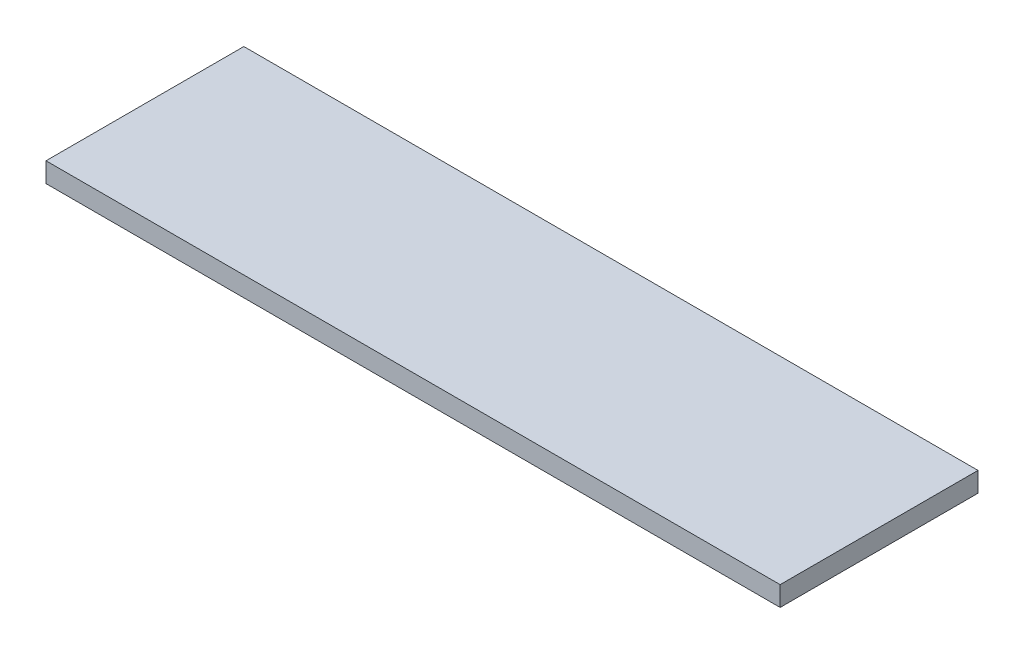
ISO-10303-21;
HEADER;
FILE_DESCRIPTION(('STEP AP214'),'2;1');
FILE_NAME('part.step','',(''),(''),'','','');
FILE_SCHEMA(('AUTOMOTIVE_DESIGN { 1 0 10303 214 1 1 1 1 }'));
ENDSEC;
DATA;
#1=APPLICATION_CONTEXT('core data for automotive mechanical design processes');
#2=APPLICATION_PROTOCOL_DEFINITION('international standard','automotive_design',2000,#1);
#3=PRODUCT_CONTEXT('',#1,'mechanical');
#4=PRODUCT('Part','Part','',(#3));
#5=PRODUCT_RELATED_PRODUCT_CATEGORY('part','',(#4));
#6=PRODUCT_DEFINITION_FORMATION('','',#4);
#7=PRODUCT_DEFINITION_CONTEXT('part definition',#1,'design');
#8=PRODUCT_DEFINITION('design','',#6,#7);
#9=PRODUCT_DEFINITION_SHAPE('','',#8);
#10=(LENGTH_UNIT() NAMED_UNIT(*) SI_UNIT(.MILLI.,.METRE.));
#11=(NAMED_UNIT(*) PLANE_ANGLE_UNIT() SI_UNIT($,.RADIAN.));
#12=(NAMED_UNIT(*) SI_UNIT($,.STERADIAN.) SOLID_ANGLE_UNIT());
#13=UNCERTAINTY_MEASURE_WITH_UNIT(LENGTH_MEASURE(1.E-05),#10,'distance_accuracy_value','');
#14=(GEOMETRIC_REPRESENTATION_CONTEXT(3) GLOBAL_UNCERTAINTY_ASSIGNED_CONTEXT((#13)) GLOBAL_UNIT_ASSIGNED_CONTEXT((#10,
#11,#12)) REPRESENTATION_CONTEXT('',''));
#15=CARTESIAN_POINT('',(0.,0.,0.));
#16=DIRECTION('',(0.,0.,1.));
#17=DIRECTION('',(1.,0.,0.));
#18=AXIS2_PLACEMENT_3D('',#15,#16,#17);
#19=CARTESIAN_POINT('',(-150.628547233686,4.,56.5202333043868));
#20=DIRECTION('',(0.,0.,-1.));
#21=DIRECTION('',(-1.,0.,0.));
#22=AXIS2_PLACEMENT_3D('',#19,#20,#21);
#23=PLANE('',#22);
#24=DIRECTION('',(1.,0.,0.));
#25=VECTOR('',#24,1.);
#26=CARTESIAN_POINT('',(-150.628547233686,4.,56.5202333043868));
#27=LINE('',#26,#25);
#28=CARTESIAN_POINT('',(-49.0498051256079,4.,56.5202333043868));
#29=VERTEX_POINT('',#28);
#30=CARTESIAN_POINT('',(99.3714527663138,4.,56.5202333043868));
#31=VERTEX_POINT('',#30);
#32=EDGE_CURVE('E86',#29,#31,#27,.T.);
#33=ORIENTED_EDGE('',*,*,#32,.F.);
#34=DIRECTION('',(0.,-1.,0.));
#35=VECTOR('',#34,1.);
#36=CARTESIAN_POINT('',(-49.0498051256079,4.,56.5202333043868));
#37=LINE('',#36,#35);
#38=CARTESIAN_POINT('',(-49.0498051256079,0.,56.5202333043868));
#39=VERTEX_POINT('',#38);
#40=EDGE_CURVE('E91',#29,#39,#37,.T.);
#41=ORIENTED_EDGE('',*,*,#40,.T.);
#42=DIRECTION('',(1.,0.,0.));
#43=VECTOR('',#42,1.);
#44=CARTESIAN_POINT('',(-150.628547233686,0.,56.5202333043868));
#45=LINE('',#44,#43);
#46=CARTESIAN_POINT('',(99.3714527663138,0.,56.5202333043868));
#47=VERTEX_POINT('',#46);
#48=EDGE_CURVE('E78',#39,#47,#45,.T.);
#49=ORIENTED_EDGE('',*,*,#48,.T.);
#50=DIRECTION('',(0.,-1.,0.));
#51=VECTOR('',#50,1.);
#52=CARTESIAN_POINT('',(99.3714527663138,4.,56.5202333043868));
#53=LINE('',#52,#51);
#54=EDGE_CURVE('E40',#31,#47,#53,.T.);
#55=ORIENTED_EDGE('',*,*,#54,.F.);
#56=EDGE_LOOP('',(#33,#41,#49,#55));
#57=FACE_BOUND('',#56,.T.);
#58=ADVANCED_FACE('F33',(#57),#23,.F.);
#59=CARTESIAN_POINT('',(99.3714527663138,4.,16.5202333043868));
#60=DIRECTION('',(-1.,0.,0.));
#61=DIRECTION('',(0.,0.,1.));
#62=AXIS2_PLACEMENT_3D('',#59,#60,#61);
#63=PLANE('',#62);
#64=DIRECTION('',(0.,0.,-1.));
#65=VECTOR('',#64,1.);
#66=CARTESIAN_POINT('',(99.3714527663138,0.,16.5202333043868));
#67=LINE('',#66,#65);
#68=CARTESIAN_POINT('',(99.3714527663138,0.,16.5202333043868));
#69=VERTEX_POINT('',#68);
#70=EDGE_CURVE('E68',#47,#69,#67,.T.);
#71=ORIENTED_EDGE('',*,*,#70,.T.);
#72=DIRECTION('',(0.,-1.,0.));
#73=VECTOR('',#72,1.);
#74=CARTESIAN_POINT('',(99.3714527663138,4.,16.5202333043868));
#75=LINE('',#74,#73);
#76=CARTESIAN_POINT('',(99.3714527663138,4.,16.5202333043868));
#77=VERTEX_POINT('',#76);
#78=EDGE_CURVE('E71',#77,#69,#75,.T.);
#79=ORIENTED_EDGE('',*,*,#78,.F.);
#80=DIRECTION('',(0.,0.,-1.));
#81=VECTOR('',#80,1.);
#82=CARTESIAN_POINT('',(99.3714527663138,4.,16.5202333043868));
#83=LINE('',#82,#81);
#84=EDGE_CURVE('E55',#31,#77,#83,.T.);
#85=ORIENTED_EDGE('',*,*,#84,.F.);
#86=ORIENTED_EDGE('',*,*,#54,.T.);
#87=EDGE_LOOP('',(#71,#79,#85,#86));
#88=FACE_BOUND('',#87,.T.);
#89=ADVANCED_FACE('F70',(#88),#63,.F.);
#90=CARTESIAN_POINT('',(-150.628547233686,4.,16.5202333043868));
#91=DIRECTION('',(0.,0.,1.));
#92=DIRECTION('',(1.,0.,0.));
#93=AXIS2_PLACEMENT_3D('',#90,#91,#92);
#94=PLANE('',#93);
#95=DIRECTION('',(-1.,0.,0.));
#96=VECTOR('',#95,1.);
#97=CARTESIAN_POINT('',(-150.628547233686,0.,16.5202333043868));
#98=LINE('',#97,#96);
#99=CARTESIAN_POINT('',(-49.0498051256079,0.,16.5202333043868));
#100=VERTEX_POINT('',#99);
#101=EDGE_CURVE('E77',#69,#100,#98,.T.);
#102=ORIENTED_EDGE('',*,*,#101,.T.);
#103=DIRECTION('',(0.,1.,0.));
#104=VECTOR('',#103,1.);
#105=CARTESIAN_POINT('',(-49.0498051256079,4.,16.5202333043868));
#106=LINE('',#105,#104);
#107=CARTESIAN_POINT('',(-49.0498051256079,4.,16.5202333043868));
#108=VERTEX_POINT('',#107);
#109=EDGE_CURVE('E47',#100,#108,#106,.T.);
#110=ORIENTED_EDGE('',*,*,#109,.T.);
#111=DIRECTION('',(-1.,0.,0.));
#112=VECTOR('',#111,1.);
#113=CARTESIAN_POINT('',(-150.628547233686,4.,16.5202333043868));
#114=LINE('',#113,#112);
#115=EDGE_CURVE('E83',#77,#108,#114,.T.);
#116=ORIENTED_EDGE('',*,*,#115,.F.);
#117=ORIENTED_EDGE('',*,*,#78,.T.);
#118=EDGE_LOOP('',(#102,#110,#116,#117));
#119=FACE_BOUND('',#118,.T.);
#120=ADVANCED_FACE('F82',(#119),#94,.F.);
#121=CARTESIAN_POINT('',(0.,4.,0.));
#122=DIRECTION('',(0.,1.,0.));
#123=DIRECTION('',(0.,0.,1.));
#124=AXIS2_PLACEMENT_3D('',#121,#122,#123);
#125=PLANE('',#124);
#126=DIRECTION('',(0.,0.,-1.));
#127=VECTOR('',#126,1.);
#128=CARTESIAN_POINT('',(-49.0498051256079,4.,0.));
#129=LINE('',#128,#127);
#130=EDGE_CURVE('E97',#29,#108,#129,.T.);
#131=ORIENTED_EDGE('',*,*,#130,.F.);
#132=ORIENTED_EDGE('',*,*,#32,.T.);
#133=ORIENTED_EDGE('',*,*,#84,.T.);
#134=ORIENTED_EDGE('',*,*,#115,.T.);
#135=EDGE_LOOP('',(#131,#132,#133,#134));
#136=FACE_BOUND('',#135,.T.);
#137=ADVANCED_FACE('F103',(#136),#125,.T.);
#138=CARTESIAN_POINT('',(0.,0.,0.));
#139=DIRECTION('',(0.,1.,0.));
#140=DIRECTION('',(0.,0.,1.));
#141=AXIS2_PLACEMENT_3D('',#138,#139,#140);
#142=PLANE('',#141);
#143=ORIENTED_EDGE('',*,*,#48,.F.);
#144=DIRECTION('',(0.,0.,-1.));
#145=VECTOR('',#144,1.);
#146=CARTESIAN_POINT('',(-49.0498051256079,0.,0.));
#147=LINE('',#146,#145);
#148=EDGE_CURVE('E11',#39,#100,#147,.T.);
#149=ORIENTED_EDGE('',*,*,#148,.T.);
#150=ORIENTED_EDGE('',*,*,#101,.F.);
#151=ORIENTED_EDGE('',*,*,#70,.F.);
#152=EDGE_LOOP('',(#143,#149,#150,#151));
#153=FACE_BOUND('',#152,.T.);
#154=ADVANCED_FACE('F85',(#153),#142,.F.);
#155=CARTESIAN_POINT('',(-49.0498051256079,10.,61.5877936872166));
#156=DIRECTION('',(1.,0.,0.));
#157=DIRECTION('',(0.,0.,-1.));
#158=AXIS2_PLACEMENT_3D('',#155,#156,#157);
#159=PLANE('',#158);
#160=ORIENTED_EDGE('',*,*,#130,.T.);
#161=ORIENTED_EDGE('',*,*,#109,.F.);
#162=ORIENTED_EDGE('',*,*,#148,.F.);
#163=ORIENTED_EDGE('',*,*,#40,.F.);
#164=EDGE_LOOP('',(#160,#161,#162,#163));
#165=FACE_BOUND('',#164,.T.);
#166=ADVANCED_FACE('F100',(#165),#159,.F.);
#167=CLOSED_SHELL('',(#58,#89,#120,#137,#154,#166));
#168=MANIFOLD_SOLID_BREP('B2',#167);
#169=ADVANCED_BREP_SHAPE_REPRESENTATION('',(#18,#168),#14);
#170=SHAPE_DEFINITION_REPRESENTATION(#9,#169);
ENDSEC;
END-ISO-10303-21;
